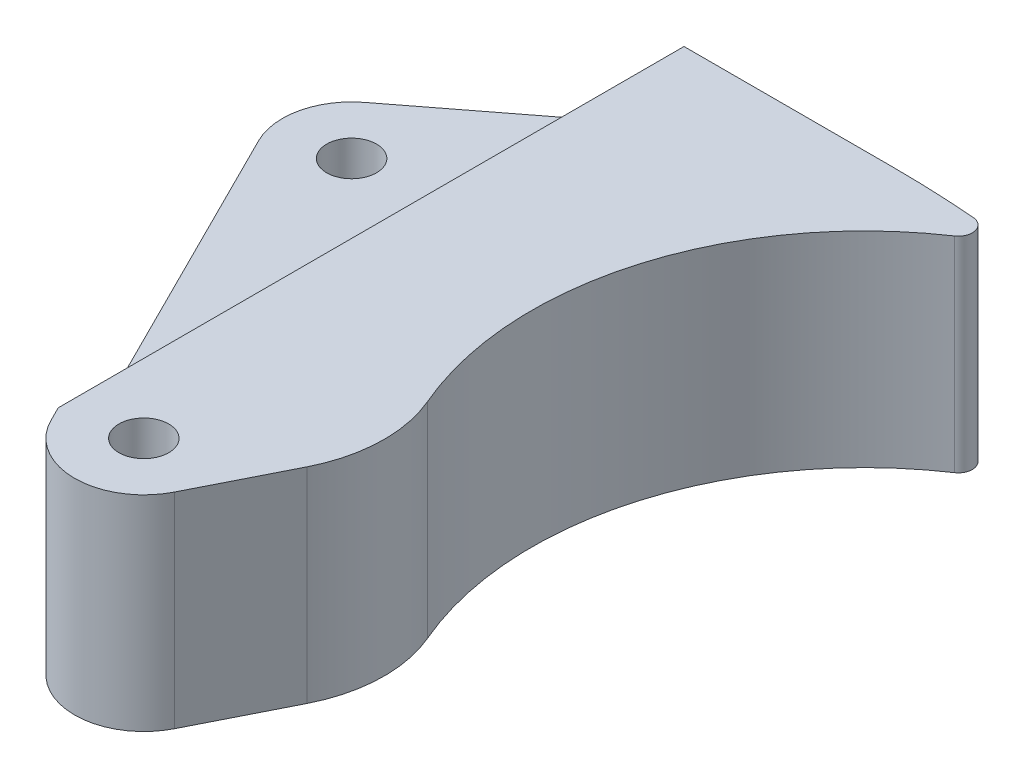
ISO-10303-21;
HEADER;
FILE_DESCRIPTION(('STEP AP214'),'2;1');
FILE_NAME('part.step','',(''),(''),'','','');
FILE_SCHEMA(('AUTOMOTIVE_DESIGN { 1 0 10303 214 1 1 1 1 }'));
ENDSEC;
DATA;
#1=APPLICATION_CONTEXT('core data for automotive mechanical design processes');
#2=APPLICATION_PROTOCOL_DEFINITION('international standard','automotive_design',2000,#1);
#3=PRODUCT_CONTEXT('',#1,'mechanical');
#4=PRODUCT('Part','Part','',(#3));
#5=PRODUCT_RELATED_PRODUCT_CATEGORY('part','',(#4));
#6=PRODUCT_DEFINITION_FORMATION('','',#4);
#7=PRODUCT_DEFINITION_CONTEXT('part definition',#1,'design');
#8=PRODUCT_DEFINITION('design','',#6,#7);
#9=PRODUCT_DEFINITION_SHAPE('','',#8);
#10=(LENGTH_UNIT() NAMED_UNIT(*) SI_UNIT(.MILLI.,.METRE.));
#11=(NAMED_UNIT(*) PLANE_ANGLE_UNIT() SI_UNIT($,.RADIAN.));
#12=(NAMED_UNIT(*) SI_UNIT($,.STERADIAN.) SOLID_ANGLE_UNIT());
#13=UNCERTAINTY_MEASURE_WITH_UNIT(LENGTH_MEASURE(1.E-05),#10,'distance_accuracy_value','');
#14=(GEOMETRIC_REPRESENTATION_CONTEXT(3) GLOBAL_UNCERTAINTY_ASSIGNED_CONTEXT((#13)) GLOBAL_UNIT_ASSIGNED_CONTEXT((#10,
#11,#12)) REPRESENTATION_CONTEXT('',''));
#15=CARTESIAN_POINT('',(0.,0.,0.));
#16=DIRECTION('',(0.,0.,1.));
#17=DIRECTION('',(1.,0.,0.));
#18=AXIS2_PLACEMENT_3D('',#15,#16,#17);
#19=CARTESIAN_POINT('',(38.1,76.2,-27.94));
#20=DIRECTION('',(0.,-1.,0.));
#21=DIRECTION('',(0.,0.,-1.));
#22=AXIS2_PLACEMENT_3D('',#19,#20,#21);
#23=CYLINDRICAL_SURFACE('',#22,30.48);
#24=CARTESIAN_POINT('',(38.1,57.404,-27.94));
#25=DIRECTION('',(0.,1.,0.));
#26=DIRECTION('',(0.,0.,1.));
#27=AXIS2_PLACEMENT_3D('',#24,#25,#26);
#28=CIRCLE('',#27,30.48);
#29=CARTESIAN_POINT('',(10.0799732428598,57.404,-15.9438130837692));
#30=VERTEX_POINT('',#29);
#31=CARTESIAN_POINT('',(21.103239153631,57.404,-53.2409984137255));
#32=VERTEX_POINT('',#31);
#33=EDGE_CURVE('E143',#30,#32,#28,.F.);
#34=ORIENTED_EDGE('',*,*,#33,.T.);
#35=DIRECTION('',(0.,-1.,0.));
#36=VECTOR('',#35,1.);
#37=CARTESIAN_POINT('',(21.103239153631,76.2,-53.2409984137255));
#38=LINE('',#37,#36);
#39=CARTESIAN_POINT('',(21.103239153631,76.2,-53.2409984137255));
#40=VERTEX_POINT('',#39);
#41=EDGE_CURVE('E146',#32,#40,#38,.F.);
#42=ORIENTED_EDGE('',*,*,#41,.T.);
#43=CARTESIAN_POINT('',(38.1,76.2,-27.94));
#44=DIRECTION('',(0.,-1.,0.));
#45=DIRECTION('',(0.,0.,1.));
#46=AXIS2_PLACEMENT_3D('',#43,#44,#45);
#47=CIRCLE('',#46,30.48);
#48=CARTESIAN_POINT('',(10.0799732428598,76.2,-15.9438130837692));
#49=VERTEX_POINT('',#48);
#50=EDGE_CURVE('E177',#49,#40,#47,.T.);
#51=ORIENTED_EDGE('',*,*,#50,.F.);
#52=DIRECTION('',(0.,-1.,0.));
#53=VECTOR('',#52,1.);
#54=CARTESIAN_POINT('',(10.0799732428598,76.2,-15.9438130837692));
#55=LINE('',#54,#53);
#56=EDGE_CURVE('E149',#49,#30,#55,.T.);
#57=ORIENTED_EDGE('',*,*,#56,.T.);
#58=EDGE_LOOP('',(#34,#42,#51,#57));
#59=FACE_BOUND('',#58,.T.);
#60=ADVANCED_FACE('F42',(#59),#23,.F.);
#61=CARTESIAN_POINT('',(12.7,76.2,39.5990316571237));
#62=DIRECTION('',(0.,-1.,0.));
#63=DIRECTION('',(0.,0.,-1.));
#64=AXIS2_PLACEMENT_3D('',#61,#62,#63);
#65=CYLINDRICAL_SURFACE('',#64,95.4790316571237);
#66=CARTESIAN_POINT('',(12.7,57.404,39.5990316571237));
#67=DIRECTION('',(0.,-1.,0.));
#68=DIRECTION('',(0.,0.,-1.));
#69=AXIS2_PLACEMENT_3D('',#66,#67,#68);
#70=CIRCLE('',#69,95.4790316571237);
#71=CARTESIAN_POINT('',(12.7,57.404,-55.88));
#72=VERTEX_POINT('',#71);
#73=CARTESIAN_POINT('',(20.4987750196921,57.404,-55.5609630590082));
#74=VERTEX_POINT('',#73);
#75=EDGE_CURVE('E58',#72,#74,#70,.T.);
#76=ORIENTED_EDGE('',*,*,#75,.F.);
#77=DIRECTION('',(0.,-1.,0.));
#78=VECTOR('',#77,1.);
#79=CARTESIAN_POINT('',(12.7,76.2,-55.88));
#80=LINE('',#79,#78);
#81=CARTESIAN_POINT('',(12.7,76.2,-55.88));
#82=VERTEX_POINT('',#81);
#83=EDGE_CURVE('E242',#82,#72,#80,.T.);
#84=ORIENTED_EDGE('',*,*,#83,.F.);
#85=CARTESIAN_POINT('',(12.7,76.2,39.5990316571237));
#86=DIRECTION('',(0.,1.,0.));
#87=DIRECTION('',(0.,0.,1.));
#88=AXIS2_PLACEMENT_3D('',#85,#86,#87);
#89=CIRCLE('',#88,95.4790316571237);
#90=CARTESIAN_POINT('',(20.4987750196921,76.2,-55.5609630590082));
#91=VERTEX_POINT('',#90);
#92=EDGE_CURVE('E182',#91,#82,#89,.T.);
#93=ORIENTED_EDGE('',*,*,#92,.F.);
#94=DIRECTION('',(0.,-1.,0.));
#95=VECTOR('',#94,1.);
#96=CARTESIAN_POINT('',(20.4987750196921,76.2,-55.5609630590082));
#97=LINE('',#96,#95);
#98=EDGE_CURVE('E163',#91,#74,#97,.T.);
#99=ORIENTED_EDGE('',*,*,#98,.T.);
#100=EDGE_LOOP('',(#76,#84,#93,#99));
#101=FACE_BOUND('',#100,.T.);
#102=ADVANCED_FACE('F298',(#101),#65,.T.);
#103=CARTESIAN_POINT('',(-6.35000000000001,76.2,-55.88));
#104=DIRECTION('',(0.,0.,1.));
#105=DIRECTION('',(1.,0.,0.));
#106=AXIS2_PLACEMENT_3D('',#103,#104,#105);
#107=PLANE('',#106);
#108=DIRECTION('',(1.,0.,0.));
#109=VECTOR('',#108,1.);
#110=CARTESIAN_POINT('',(-6.35000000000001,57.404,-55.88));
#111=LINE('',#110,#109);
#112=CARTESIAN_POINT('',(-6.35000000000001,57.404,-55.88));
#113=VERTEX_POINT('',#112);
#114=EDGE_CURVE('E280',#113,#72,#111,.T.);
#115=ORIENTED_EDGE('',*,*,#114,.F.);
#116=DIRECTION('',(0.,-1.,0.));
#117=VECTOR('',#116,1.);
#118=CARTESIAN_POINT('',(-6.35000000000001,0.,-55.88));
#119=LINE('',#118,#117);
#120=CARTESIAN_POINT('',(-6.35000000000001,63.5,-55.88));
#121=VERTEX_POINT('',#120);
#122=EDGE_CURVE('E195',#121,#113,#119,.T.);
#123=ORIENTED_EDGE('',*,*,#122,.F.);
#124=DIRECTION('',(0.,-1.,0.));
#125=VECTOR('',#124,1.);
#126=CARTESIAN_POINT('',(-6.35000000000001,76.2,-55.88));
#127=LINE('',#126,#125);
#128=CARTESIAN_POINT('',(-6.35,69.85,-55.88));
#129=VERTEX_POINT('',#128);
#130=EDGE_CURVE('E238',#129,#121,#127,.T.);
#131=ORIENTED_EDGE('',*,*,#130,.F.);
#132=CARTESIAN_POINT('',(-6.35000000000001,76.2,-55.88));
#133=VERTEX_POINT('',#132);
#134=EDGE_CURVE('E239',#133,#129,#127,.T.);
#135=ORIENTED_EDGE('',*,*,#134,.F.);
#136=DIRECTION('',(-1.,0.,0.));
#137=VECTOR('',#136,1.);
#138=CARTESIAN_POINT('',(-6.35000000000001,76.2,-55.88));
#139=LINE('',#138,#137);
#140=EDGE_CURVE('E235',#82,#133,#139,.T.);
#141=ORIENTED_EDGE('',*,*,#140,.F.);
#142=ORIENTED_EDGE('',*,*,#83,.T.);
#143=EDGE_LOOP('',(#115,#123,#131,#135,#141,#142));
#144=FACE_BOUND('',#143,.T.);
#145=ADVANCED_FACE('F278',(#144),#107,.F.);
#146=CARTESIAN_POINT('',(-6.35000000000001,0.,6.35));
#147=DIRECTION('',(1.,0.,0.));
#148=DIRECTION('',(0.,0.,-1.));
#149=AXIS2_PLACEMENT_3D('',#146,#147,#148);
#150=PLANE('',#149);
#151=ORIENTED_EDGE('',*,*,#122,.T.);
#152=DIRECTION('',(0.,0.,1.));
#153=VECTOR('',#152,1.);
#154=CARTESIAN_POINT('',(-6.35000000000001,57.404,6.34999999999999));
#155=LINE('',#154,#153);
#156=CARTESIAN_POINT('',(-6.35000000000001,57.404,1.49903165712365));
#157=VERTEX_POINT('',#156);
#158=EDGE_CURVE('E166',#113,#157,#155,.T.);
#159=ORIENTED_EDGE('',*,*,#158,.T.);
#160=DIRECTION('',(0.,-1.,0.));
#161=VECTOR('',#160,1.);
#162=CARTESIAN_POINT('',(-6.35000000000001,76.2,1.49903165712365));
#163=LINE('',#162,#161);
#164=CARTESIAN_POINT('',(-6.35000000000001,63.5,1.49903165712365));
#165=VERTEX_POINT('',#164);
#166=EDGE_CURVE('E225',#165,#157,#163,.T.);
#167=ORIENTED_EDGE('',*,*,#166,.F.);
#168=DIRECTION('',(0.,0.,-1.));
#169=VECTOR('',#168,1.);
#170=CARTESIAN_POINT('',(-6.35000000000001,63.5,6.35));
#171=LINE('',#170,#169);
#172=EDGE_CURVE('E198',#165,#121,#171,.T.);
#173=ORIENTED_EDGE('',*,*,#172,.T.);
#174=EDGE_LOOP('',(#151,#159,#167,#173));
#175=FACE_BOUND('',#174,.T.);
#176=ADVANCED_FACE('F261',(#175),#150,.F.);
#177=CARTESIAN_POINT('',(20.3950407850323,76.2,-54.295206680964));
#178=DIRECTION('',(0.,1.,0.));
#179=DIRECTION('',(0.,0.,1.));
#180=AXIS2_PLACEMENT_3D('',#177,#178,#179);
#181=CYLINDRICAL_SURFACE('',#180,1.27);
#182=ORIENTED_EDGE('',*,*,#41,.F.);
#183=CARTESIAN_POINT('',(20.3950407850323,57.404,-54.295206680964));
#184=DIRECTION('',(0.,-1.,0.));
#185=DIRECTION('',(0.,0.,-1.));
#186=AXIS2_PLACEMENT_3D('',#183,#184,#185);
#187=CIRCLE('',#186,1.27);
#188=EDGE_CURVE('E154',#32,#74,#187,.F.);
#189=ORIENTED_EDGE('',*,*,#188,.T.);
#190=ORIENTED_EDGE('',*,*,#98,.F.);
#191=CARTESIAN_POINT('',(20.3950407850323,76.2,-54.295206680964));
#192=DIRECTION('',(0.,1.,0.));
#193=DIRECTION('',(0.,0.,1.));
#194=AXIS2_PLACEMENT_3D('',#191,#192,#193);
#195=CIRCLE('',#194,1.27);
#196=EDGE_CURVE('E162',#40,#91,#195,.T.);
#197=ORIENTED_EDGE('',*,*,#196,.F.);
#198=EDGE_LOOP('',(#182,#189,#190,#197));
#199=FACE_BOUND('',#198,.T.);
#200=ADVANCED_FACE('F161',(#199),#181,.T.);
#201=CARTESIAN_POINT('',(12.7,76.2,39.5990316571237));
#202=DIRECTION('',(0.,1.,0.));
#203=DIRECTION('',(0.,0.,1.));
#204=AXIS2_PLACEMENT_3D('',#201,#202,#203);
#205=PLANE('',#204);
#206=DIRECTION('',(0.450015260137261,0.,-0.893020865178185));
#207=VECTOR('',#206,1.);
#208=CARTESIAN_POINT('',(5.67068249388147,76.2,2.8575969018716));
#209=LINE('',#208,#207);
#210=CARTESIAN_POINT('',(5.67068249388147,76.2,2.8575969018716));
#211=VERTEX_POINT('',#210);
#212=CARTESIAN_POINT('',(9.74632708181432,76.2,-5.23020806492983));
#213=VERTEX_POINT('',#212);
#214=EDGE_CURVE('E176',#211,#213,#209,.T.);
#215=ORIENTED_EDGE('',*,*,#214,.T.);
#216=CARTESIAN_POINT('',(-1.59503790594863,76.2,-10.945401868673));
#217=DIRECTION('',(0.,1.,0.));
#218=DIRECTION('',(0.,0.,1.));
#219=AXIS2_PLACEMENT_3D('',#216,#217,#218);
#220=CIRCLE('',#219,12.7);
#221=EDGE_CURVE('E11',#213,#49,#220,.T.);
#222=ORIENTED_EDGE('',*,*,#221,.T.);
#223=ORIENTED_EDGE('',*,*,#50,.T.);
#224=ORIENTED_EDGE('',*,*,#196,.T.);
#225=ORIENTED_EDGE('',*,*,#92,.T.);
#226=ORIENTED_EDGE('',*,*,#140,.T.);
#227=DIRECTION('',(0.,0.,-1.));
#228=VECTOR('',#227,1.);
#229=CARTESIAN_POINT('',(-6.35,76.2,6.35));
#230=LINE('',#229,#228);
#231=CARTESIAN_POINT('',(-6.35,76.2,1.49903165712367));
#232=VERTEX_POINT('',#231);
#233=EDGE_CURVE('E199',#232,#133,#230,.T.);
#234=ORIENTED_EDGE('',*,*,#233,.F.);
#235=DIRECTION('',(0.447213595499958,0.,0.894427190999916));
#236=VECTOR('',#235,1.);
#237=CARTESIAN_POINT('',(-5.67961266284947,76.2,2.83980633142473));
#238=LINE('',#237,#236);
#239=CARTESIAN_POINT('',(-5.67961266284947,76.2,2.83980633142473));
#240=VERTEX_POINT('',#239);
#241=EDGE_CURVE('E231',#232,#240,#238,.T.);
#242=ORIENTED_EDGE('',*,*,#241,.T.);
#243=CARTESIAN_POINT('',(0.,76.2,0.));
#244=DIRECTION('',(0.,1.,0.));
#245=DIRECTION('',(0.,0.,1.));
#246=AXIS2_PLACEMENT_3D('',#243,#244,#245);
#247=CIRCLE('',#246,6.35);
#248=EDGE_CURVE('E178',#240,#211,#247,.T.);
#249=ORIENTED_EDGE('',*,*,#248,.T.);
#250=EDGE_LOOP('',(#215,#222,#223,#224,#225,#226,#234,#242,#249));
#251=FACE_BOUND('',#250,.T.);
#252=CARTESIAN_POINT('',(0.,76.2,0.));
#253=DIRECTION('',(0.,1.,0.));
#254=DIRECTION('',(0.,0.,1.));
#255=AXIS2_PLACEMENT_3D('',#252,#253,#254);
#256=CIRCLE('',#255,2.286);
#257=CARTESIAN_POINT('',(0.,76.2,-2.286));
#258=VERTEX_POINT('',#257);
#259=EDGE_CURVE('E228',#258,#258,#256,.T.);
#260=ORIENTED_EDGE('',*,*,#259,.F.);
#261=EDGE_LOOP('',(#260));
#262=FACE_BOUND('',#261,.T.);
#263=ADVANCED_FACE('F295',(#251,#262),#205,.T.);
#264=CARTESIAN_POINT('',(-22.9215496675251,76.2,-43.1332497625179));
#265=DIRECTION('',(0.60969286102757,0.,0.792637757876835));
#266=DIRECTION('',(0.792637757876835,0.,-0.60969286102757));
#267=AXIS2_PLACEMENT_3D('',#264,#265,#266);
#268=PLANE('',#267);
#269=ORIENTED_EDGE('',*,*,#130,.T.);
#270=DIRECTION('',(-0.792637757876835,0.,0.60969286102757));
#271=VECTOR('',#270,1.);
#272=CARTESIAN_POINT('',(-22.9215496675251,63.5,-43.1332497625179));
#273=LINE('',#272,#271);
#274=CARTESIAN_POINT('',(-22.9215496675251,63.5,-43.1332497625179));
#275=VERTEX_POINT('',#274);
#276=EDGE_CURVE('E219',#121,#275,#273,.T.);
#277=ORIENTED_EDGE('',*,*,#276,.T.);
#278=DIRECTION('',(0.,-1.,0.));
#279=VECTOR('',#278,1.);
#280=CARTESIAN_POINT('',(-22.9215496675251,76.2,-43.1332497625179));
#281=LINE('',#280,#279);
#282=CARTESIAN_POINT('',(-22.9215496675251,69.85,-43.1332497625179));
#283=VERTEX_POINT('',#282);
#284=EDGE_CURVE('E253',#283,#275,#281,.T.);
#285=ORIENTED_EDGE('',*,*,#284,.F.);
#286=DIRECTION('',(0.792637757876835,0.,-0.60969286102757));
#287=VECTOR('',#286,1.);
#288=CARTESIAN_POINT('',(-22.9215496675251,69.85,-43.1332497625179));
#289=LINE('',#288,#287);
#290=EDGE_CURVE('E210',#283,#129,#289,.T.);
#291=ORIENTED_EDGE('',*,*,#290,.T.);
#292=EDGE_LOOP('',(#269,#277,#285,#291));
#293=FACE_BOUND('',#292,.T.);
#294=ADVANCED_FACE('F281',(#293),#268,.F.);
#295=CARTESIAN_POINT('',(-19.05,76.2,-38.1));
#296=DIRECTION('',(0.,-1.,0.));
#297=DIRECTION('',(0.,0.,-1.));
#298=AXIS2_PLACEMENT_3D('',#295,#296,#297);
#299=CYLINDRICAL_SURFACE('',#298,6.35);
#300=CARTESIAN_POINT('',(-19.05,63.5,-38.1));
#301=DIRECTION('',(0.,1.,0.));
#302=DIRECTION('',(0.,0.,1.));
#303=AXIS2_PLACEMENT_3D('',#300,#301,#302);
#304=CIRCLE('',#303,6.35);
#305=CARTESIAN_POINT('',(-24.7296126628495,63.5,-35.2601936685753));
#306=VERTEX_POINT('',#305);
#307=EDGE_CURVE('E217',#275,#306,#304,.T.);
#308=ORIENTED_EDGE('',*,*,#307,.T.);
#309=DIRECTION('',(0.,-1.,0.));
#310=VECTOR('',#309,1.);
#311=CARTESIAN_POINT('',(-24.7296126628495,76.2,-35.2601936685753));
#312=LINE('',#311,#310);
#313=CARTESIAN_POINT('',(-24.7296126628495,69.85,-35.2601936685753));
#314=VERTEX_POINT('',#313);
#315=EDGE_CURVE('E250',#314,#306,#312,.T.);
#316=ORIENTED_EDGE('',*,*,#315,.F.);
#317=CARTESIAN_POINT('',(-19.05,69.85,-38.1));
#318=DIRECTION('',(0.,-1.,0.));
#319=DIRECTION('',(0.,0.,-1.));
#320=AXIS2_PLACEMENT_3D('',#317,#318,#319);
#321=CIRCLE('',#320,6.35);
#322=EDGE_CURVE('E207',#314,#283,#321,.T.);
#323=ORIENTED_EDGE('',*,*,#322,.T.);
#324=ORIENTED_EDGE('',*,*,#284,.T.);
#325=EDGE_LOOP('',(#308,#316,#323,#324));
#326=FACE_BOUND('',#325,.T.);
#327=ADVANCED_FACE('F286',(#326),#299,.T.);
#328=CARTESIAN_POINT('',(-5.67961266284947,76.2,2.83980633142473));
#329=DIRECTION('',(0.894427190999916,0.,-0.447213595499958));
#330=DIRECTION('',(-0.447213595499958,0.,-0.894427190999916));
#331=AXIS2_PLACEMENT_3D('',#328,#329,#330);
#332=PLANE('',#331);
#333=ORIENTED_EDGE('',*,*,#166,.T.);
#334=DIRECTION('',(0.447213595499958,0.,0.894427190999916));
#335=VECTOR('',#334,1.);
#336=CARTESIAN_POINT('',(-5.67961266284946,57.404,2.83980633142474));
#337=LINE('',#336,#335);
#338=CARTESIAN_POINT('',(-5.67961266284947,57.404,2.83980633142473));
#339=VERTEX_POINT('',#338);
#340=EDGE_CURVE('E188',#157,#339,#337,.T.);
#341=ORIENTED_EDGE('',*,*,#340,.T.);
#342=DIRECTION('',(0.,-1.,0.));
#343=VECTOR('',#342,1.);
#344=CARTESIAN_POINT('',(-5.67961266284947,76.2,2.83980633142473));
#345=LINE('',#344,#343);
#346=EDGE_CURVE('E247',#240,#339,#345,.T.);
#347=ORIENTED_EDGE('',*,*,#346,.F.);
#348=ORIENTED_EDGE('',*,*,#241,.F.);
#349=DIRECTION('',(0.,-1.,0.));
#350=VECTOR('',#349,1.);
#351=CARTESIAN_POINT('',(-6.35,76.2,1.49903165712366));
#352=LINE('',#351,#350);
#353=CARTESIAN_POINT('',(-6.35,69.85,1.49903165712366));
#354=VERTEX_POINT('',#353);
#355=EDGE_CURVE('E222',#232,#354,#352,.T.);
#356=ORIENTED_EDGE('',*,*,#355,.T.);
#357=DIRECTION('',(-0.447213595499958,0.,-0.894427190999916));
#358=VECTOR('',#357,1.);
#359=CARTESIAN_POINT('',(-5.67961266284947,69.85,2.83980633142473));
#360=LINE('',#359,#358);
#361=EDGE_CURVE('E204',#354,#314,#360,.T.);
#362=ORIENTED_EDGE('',*,*,#361,.T.);
#363=ORIENTED_EDGE('',*,*,#315,.T.);
#364=DIRECTION('',(0.447213595499958,0.,0.894427190999916));
#365=VECTOR('',#364,1.);
#366=CARTESIAN_POINT('',(-5.67961266284947,63.5,2.83980633142473));
#367=LINE('',#366,#365);
#368=EDGE_CURVE('E214',#306,#165,#367,.T.);
#369=ORIENTED_EDGE('',*,*,#368,.T.);
#370=EDGE_LOOP('',(#333,#341,#347,#348,#356,#362,#363,#369));
#371=FACE_BOUND('',#370,.T.);
#372=ADVANCED_FACE('F266',(#371),#332,.F.);
#373=CARTESIAN_POINT('',(0.,76.2,0.));
#374=DIRECTION('',(0.,-1.,0.));
#375=DIRECTION('',(0.,0.,-1.));
#376=AXIS2_PLACEMENT_3D('',#373,#374,#375);
#377=CYLINDRICAL_SURFACE('',#376,6.35);
#378=CARTESIAN_POINT('',(0.,57.404,0.));
#379=DIRECTION('',(0.,1.,0.));
#380=DIRECTION('',(0.,0.,1.));
#381=AXIS2_PLACEMENT_3D('',#378,#379,#380);
#382=CIRCLE('',#381,6.35);
#383=CARTESIAN_POINT('',(5.67068249388147,57.404,2.8575969018716));
#384=VERTEX_POINT('',#383);
#385=EDGE_CURVE('E184',#339,#384,#382,.T.);
#386=ORIENTED_EDGE('',*,*,#385,.T.);
#387=DIRECTION('',(0.,-1.,0.));
#388=VECTOR('',#387,1.);
#389=CARTESIAN_POINT('',(5.67068249388147,76.2,2.8575969018716));
#390=LINE('',#389,#388);
#391=EDGE_CURVE('E245',#211,#384,#390,.T.);
#392=ORIENTED_EDGE('',*,*,#391,.F.);
#393=ORIENTED_EDGE('',*,*,#248,.F.);
#394=ORIENTED_EDGE('',*,*,#346,.T.);
#395=EDGE_LOOP('',(#386,#392,#393,#394));
#396=FACE_BOUND('',#395,.T.);
#397=ADVANCED_FACE('F293',(#396),#377,.T.);
#398=CARTESIAN_POINT('',(5.67068249388147,76.2,2.8575969018716));
#399=DIRECTION('',(-0.893020865178185,0.,-0.450015260137261));
#400=DIRECTION('',(-0.450015260137261,0.,0.893020865178185));
#401=AXIS2_PLACEMENT_3D('',#398,#399,#400);
#402=PLANE('',#401);
#403=DIRECTION('',(0.450015260137261,0.,-0.893020865178185));
#404=VECTOR('',#403,1.);
#405=CARTESIAN_POINT('',(5.67068249388147,57.404,2.85759690187161));
#406=LINE('',#405,#404);
#407=CARTESIAN_POINT('',(9.74632708181432,57.404,-5.23020806492983));
#408=VERTEX_POINT('',#407);
#409=EDGE_CURVE('E151',#384,#408,#406,.T.);
#410=ORIENTED_EDGE('',*,*,#409,.T.);
#411=DIRECTION('',(0.,-1.,0.));
#412=VECTOR('',#411,1.);
#413=CARTESIAN_POINT('',(9.74632708181432,76.2,-5.23020806492983));
#414=LINE('',#413,#412);
#415=EDGE_CURVE('E51',#408,#213,#414,.F.);
#416=ORIENTED_EDGE('',*,*,#415,.T.);
#417=ORIENTED_EDGE('',*,*,#214,.F.);
#418=ORIENTED_EDGE('',*,*,#391,.T.);
#419=EDGE_LOOP('',(#410,#416,#417,#418));
#420=FACE_BOUND('',#419,.T.);
#421=ADVANCED_FACE('F307',(#420),#402,.F.);
#422=CARTESIAN_POINT('',(0.,76.2,0.));
#423=DIRECTION('',(0.,-1.,0.));
#424=DIRECTION('',(0.,0.,-1.));
#425=AXIS2_PLACEMENT_3D('',#422,#423,#424);
#426=CYLINDRICAL_SURFACE('',#425,2.286);
#427=CARTESIAN_POINT('',(0.,57.404,0.));
#428=DIRECTION('',(0.,1.,0.));
#429=DIRECTION('',(0.,0.,1.));
#430=AXIS2_PLACEMENT_3D('',#427,#428,#429);
#431=CIRCLE('',#430,2.286);
#432=CARTESIAN_POINT('',(0.,57.404,-2.286));
#433=VERTEX_POINT('',#432);
#434=EDGE_CURVE('E152',#433,#433,#431,.T.);
#435=CARTESIAN_POINT('',(0.,57.404,-2.286));
#436=CARTESIAN_POINT('',(0.,57.5997916666667,-2.286));
#437=CARTESIAN_POINT('',(0.,57.7955833333333,-2.286));
#438=CARTESIAN_POINT('',(0.,58.1871666666667,-2.286));
#439=CARTESIAN_POINT('',(0.,58.3829583333333,-2.286));
#440=CARTESIAN_POINT('',(0.,58.7745416666667,-2.286));
#441=CARTESIAN_POINT('',(0.,58.9703333333333,-2.286));
#442=CARTESIAN_POINT('',(0.,59.3619166666667,-2.286));
#443=CARTESIAN_POINT('',(0.,59.5577083333333,-2.286));
#444=CARTESIAN_POINT('',(0.,59.9492916666667,-2.286));
#445=CARTESIAN_POINT('',(0.,60.1450833333333,-2.286));
#446=CARTESIAN_POINT('',(0.,60.5366666666667,-2.286));
#447=CARTESIAN_POINT('',(0.,60.7324583333333,-2.286));
#448=CARTESIAN_POINT('',(0.,61.1240416666667,-2.286));
#449=CARTESIAN_POINT('',(0.,61.3198333333333,-2.286));
#450=CARTESIAN_POINT('',(0.,61.7114166666667,-2.286));
#451=CARTESIAN_POINT('',(0.,61.9072083333333,-2.286));
#452=CARTESIAN_POINT('',(0.,62.2987916666667,-2.286));
#453=CARTESIAN_POINT('',(0.,62.4945833333333,-2.286));
#454=CARTESIAN_POINT('',(0.,62.8861666666667,-2.286));
#455=CARTESIAN_POINT('',(0.,63.0819583333333,-2.286));
#456=CARTESIAN_POINT('',(0.,63.4735416666667,-2.286));
#457=CARTESIAN_POINT('',(0.,63.6693333333333,-2.286));
#458=CARTESIAN_POINT('',(0.,64.0609166666667,-2.286));
#459=CARTESIAN_POINT('',(0.,64.2567083333333,-2.286));
#460=CARTESIAN_POINT('',(0.,64.6482916666667,-2.286));
#461=CARTESIAN_POINT('',(0.,64.8440833333333,-2.286));
#462=CARTESIAN_POINT('',(0.,65.2356666666667,-2.286));
#463=CARTESIAN_POINT('',(0.,65.4314583333333,-2.286));
#464=CARTESIAN_POINT('',(0.,65.8230416666667,-2.286));
#465=CARTESIAN_POINT('',(0.,66.0188333333333,-2.286));
#466=CARTESIAN_POINT('',(0.,66.4104166666667,-2.286));
#467=CARTESIAN_POINT('',(0.,66.6062083333333,-2.286));
#468=CARTESIAN_POINT('',(0.,66.9977916666667,-2.286));
#469=CARTESIAN_POINT('',(0.,67.1935833333333,-2.286));
#470=CARTESIAN_POINT('',(0.,67.5851666666667,-2.286));
#471=CARTESIAN_POINT('',(0.,67.7809583333333,-2.286));
#472=CARTESIAN_POINT('',(0.,68.1725416666667,-2.286));
#473=CARTESIAN_POINT('',(0.,68.3683333333333,-2.286));
#474=CARTESIAN_POINT('',(0.,68.7599166666667,-2.286));
#475=CARTESIAN_POINT('',(0.,68.9557083333333,-2.286));
#476=CARTESIAN_POINT('',(0.,69.3472916666667,-2.286));
#477=CARTESIAN_POINT('',(0.,69.5430833333333,-2.286));
#478=CARTESIAN_POINT('',(0.,69.9346666666667,-2.286));
#479=CARTESIAN_POINT('',(0.,70.1304583333333,-2.286));
#480=CARTESIAN_POINT('',(0.,70.5220416666667,-2.286));
#481=CARTESIAN_POINT('',(0.,70.7178333333333,-2.286));
#482=CARTESIAN_POINT('',(0.,71.1094166666667,-2.286));
#483=CARTESIAN_POINT('',(0.,71.3052083333333,-2.286));
#484=CARTESIAN_POINT('',(0.,71.6967916666667,-2.286));
#485=CARTESIAN_POINT('',(0.,71.8925833333333,-2.286));
#486=CARTESIAN_POINT('',(0.,72.2841666666667,-2.286));
#487=CARTESIAN_POINT('',(0.,72.4799583333333,-2.286));
#488=CARTESIAN_POINT('',(0.,72.8715416666667,-2.286));
#489=CARTESIAN_POINT('',(0.,73.0673333333333,-2.286));
#490=CARTESIAN_POINT('',(0.,73.4589166666667,-2.286));
#491=CARTESIAN_POINT('',(0.,73.6547083333333,-2.286));
#492=CARTESIAN_POINT('',(0.,74.0462916666667,-2.286));
#493=CARTESIAN_POINT('',(0.,74.2420833333333,-2.286));
#494=CARTESIAN_POINT('',(0.,74.6336666666667,-2.286));
#495=CARTESIAN_POINT('',(0.,74.8294583333333,-2.286));
#496=CARTESIAN_POINT('',(0.,75.2210416666667,-2.286));
#497=CARTESIAN_POINT('',(0.,75.4168333333333,-2.286));
#498=CARTESIAN_POINT('',(0.,75.8084166666667,-2.286));
#499=CARTESIAN_POINT('',(0.,76.0042083333333,-2.286));
#500=CARTESIAN_POINT('',(0.,76.2,-2.286));
#501=B_SPLINE_CURVE_WITH_KNOTS('',3,(#435,#436,#437,#438,#439,#440,#441,#442,#443,#444,#445,
#446,#447,#448,#449,#450,#451,#452,#453,#454,#455,#456,#457,#458,#459,#460,#461,#462,#463,#464,
#465,#466,#467,#468,#469,#470,#471,#472,#473,#474,#475,#476,#477,#478,#479,#480,#481,#482,#483,
#484,#485,#486,#487,#488,#489,#490,#491,#492,#493,#494,#495,#496,#497,#498,#499,#500),
.UNSPECIFIED.,.F.,.F.,(4,2,2,2,2,2,2,2,2,2,2,2,2,2,2,2,2,2,2,2,2,2,2,2,2,2,2,2,2,2,2,2,4),(0.,
0.587375000000001,1.17475,1.762125,2.34949999999999,2.93687499999999,3.52424999999999,
4.11162499999999,4.69899999999999,5.286375,5.87375,6.461125,7.04849999999999,7.63587499999999,
8.22324999999999,8.81062499999999,9.39799999999999,9.98537499999999,10.57275,11.160125,11.7475,
12.334875,12.92225,13.509625,14.097,14.684375,15.27175,15.859125,16.4465,17.033875,17.62125,
18.208625,18.796),.UNSPECIFIED.);
#502=EDGE_CURVE('BSEAM310',#433,#258,#501,.T.);
#503=ORIENTED_EDGE('',*,*,#434,.F.);
#504=ORIENTED_EDGE('',*,*,#259,.T.);
#505=ORIENTED_EDGE('',*,*,#502,.T.);
#506=ORIENTED_EDGE('',*,*,#502,.F.);
#507=EDGE_LOOP('',(#503,#505,#504,#506));
#508=FACE_BOUND('',#507,.T.);
#509=ADVANCED_FACE('F310',(#508),#426,.F.);
#510=CARTESIAN_POINT('',(-6.35,76.2,6.35));
#511=DIRECTION('',(1.,0.,0.));
#512=DIRECTION('',(0.,0.,-1.));
#513=AXIS2_PLACEMENT_3D('',#510,#511,#512);
#514=PLANE('',#513);
#515=ORIENTED_EDGE('',*,*,#233,.T.);
#516=ORIENTED_EDGE('',*,*,#134,.T.);
#517=DIRECTION('',(0.,0.,-1.));
#518=VECTOR('',#517,1.);
#519=CARTESIAN_POINT('',(-6.35,69.85,6.35));
#520=LINE('',#519,#518);
#521=EDGE_CURVE('E194',#354,#129,#520,.T.);
#522=ORIENTED_EDGE('',*,*,#521,.F.);
#523=ORIENTED_EDGE('',*,*,#355,.F.);
#524=EDGE_LOOP('',(#515,#516,#522,#523));
#525=FACE_BOUND('',#524,.T.);
#526=ADVANCED_FACE('F340',(#525),#514,.F.);
#527=CARTESIAN_POINT('',(-25.4,69.85,6.35));
#528=DIRECTION('',(0.,-1.,0.));
#529=DIRECTION('',(0.,0.,-1.));
#530=AXIS2_PLACEMENT_3D('',#527,#528,#529);
#531=PLANE('',#530);
#532=CARTESIAN_POINT('',(-19.05,69.85,-38.1));
#533=DIRECTION('',(0.,-1.,0.));
#534=DIRECTION('',(0.,0.,-1.));
#535=AXIS2_PLACEMENT_3D('',#532,#533,#534);
#536=CIRCLE('',#535,2.286);
#537=CARTESIAN_POINT('',(-19.05,69.85,-40.386));
#538=VERTEX_POINT('',#537);
#539=EDGE_CURVE('E201',#538,#538,#536,.T.);
#540=ORIENTED_EDGE('',*,*,#539,.T.);
#541=EDGE_LOOP('',(#540));
#542=FACE_BOUND('',#541,.T.);
#543=ORIENTED_EDGE('',*,*,#322,.F.);
#544=ORIENTED_EDGE('',*,*,#361,.F.);
#545=ORIENTED_EDGE('',*,*,#521,.T.);
#546=ORIENTED_EDGE('',*,*,#290,.F.);
#547=EDGE_LOOP('',(#543,#544,#545,#546));
#548=FACE_BOUND('',#547,.T.);
#549=ADVANCED_FACE('F283',(#542,#548),#531,.F.);
#550=CARTESIAN_POINT('',(-6.35000000000001,63.5,6.35));
#551=DIRECTION('',(0.,1.,0.));
#552=DIRECTION('',(0.,0.,1.));
#553=AXIS2_PLACEMENT_3D('',#550,#551,#552);
#554=PLANE('',#553);
#555=CARTESIAN_POINT('',(-19.05,63.5,-38.1));
#556=DIRECTION('',(0.,1.,0.));
#557=DIRECTION('',(0.,0.,1.));
#558=AXIS2_PLACEMENT_3D('',#555,#556,#557);
#559=CIRCLE('',#558,2.286);
#560=CARTESIAN_POINT('',(-19.05,63.5,-40.386));
#561=VERTEX_POINT('',#560);
#562=EDGE_CURVE('E213',#561,#561,#559,.T.);
#563=ORIENTED_EDGE('',*,*,#562,.T.);
#564=EDGE_LOOP('',(#563));
#565=FACE_BOUND('',#564,.T.);
#566=ORIENTED_EDGE('',*,*,#172,.F.);
#567=ORIENTED_EDGE('',*,*,#368,.F.);
#568=ORIENTED_EDGE('',*,*,#307,.F.);
#569=ORIENTED_EDGE('',*,*,#276,.F.);
#570=EDGE_LOOP('',(#566,#567,#568,#569));
#571=FACE_BOUND('',#570,.T.);
#572=ADVANCED_FACE('F271',(#565,#571),#554,.F.);
#573=CARTESIAN_POINT('',(-19.05,76.2,-38.1));
#574=DIRECTION('',(0.,-1.,0.));
#575=DIRECTION('',(0.,0.,-1.));
#576=AXIS2_PLACEMENT_3D('',#573,#574,#575);
#577=CYLINDRICAL_SURFACE('',#576,2.286);
#578=CARTESIAN_POINT('',(-19.05,63.5,-40.386));
#579=CARTESIAN_POINT('',(-19.05,63.5661458333334,-40.386));
#580=CARTESIAN_POINT('',(-19.05,63.6322916666667,-40.386));
#581=CARTESIAN_POINT('',(-19.05,63.7645833333333,-40.386));
#582=CARTESIAN_POINT('',(-19.05,63.8307291666667,-40.386));
#583=CARTESIAN_POINT('',(-19.05,63.9630208333333,-40.386));
#584=CARTESIAN_POINT('',(-19.05,64.0291666666667,-40.386));
#585=CARTESIAN_POINT('',(-19.05,64.1614583333334,-40.386));
#586=CARTESIAN_POINT('',(-19.05,64.2276041666667,-40.386));
#587=CARTESIAN_POINT('',(-19.05,64.3598958333334,-40.386));
#588=CARTESIAN_POINT('',(-19.05,64.4260416666667,-40.386));
#589=CARTESIAN_POINT('',(-19.05,64.5583333333333,-40.386));
#590=CARTESIAN_POINT('',(-19.05,64.6244791666667,-40.386));
#591=CARTESIAN_POINT('',(-19.05,64.7567708333333,-40.386));
#592=CARTESIAN_POINT('',(-19.05,64.8229166666667,-40.386));
#593=CARTESIAN_POINT('',(-19.05,64.9552083333333,-40.386));
#594=CARTESIAN_POINT('',(-19.05,65.0213541666667,-40.386));
#595=CARTESIAN_POINT('',(-19.05,65.1536458333333,-40.386));
#596=CARTESIAN_POINT('',(-19.05,65.2197916666667,-40.386));
#597=CARTESIAN_POINT('',(-19.05,65.3520833333334,-40.386));
#598=CARTESIAN_POINT('',(-19.05,65.4182291666667,-40.386));
#599=CARTESIAN_POINT('',(-19.05,65.5505208333334,-40.386));
#600=CARTESIAN_POINT('',(-19.05,65.6166666666667,-40.386));
#601=CARTESIAN_POINT('',(-19.05,65.7489583333333,-40.386));
#602=CARTESIAN_POINT('',(-19.05,65.8151041666667,-40.386));
#603=CARTESIAN_POINT('',(-19.05,65.9473958333333,-40.386));
#604=CARTESIAN_POINT('',(-19.05,66.0135416666667,-40.386));
#605=CARTESIAN_POINT('',(-19.05,66.1458333333333,-40.386));
#606=CARTESIAN_POINT('',(-19.05,66.2119791666667,-40.386));
#607=CARTESIAN_POINT('',(-19.05,66.3442708333333,-40.386));
#608=CARTESIAN_POINT('',(-19.05,66.4104166666667,-40.386));
#609=CARTESIAN_POINT('',(-19.05,66.5427083333334,-40.386));
#610=CARTESIAN_POINT('',(-19.05,66.6088541666667,-40.386));
#611=CARTESIAN_POINT('',(-19.05,66.7411458333333,-40.386));
#612=CARTESIAN_POINT('',(-19.05,66.8072916666667,-40.386));
#613=CARTESIAN_POINT('',(-19.05,66.9395833333333,-40.386));
#614=CARTESIAN_POINT('',(-19.05,67.0057291666667,-40.386));
#615=CARTESIAN_POINT('',(-19.05,67.1380208333334,-40.386));
#616=CARTESIAN_POINT('',(-19.05,67.2041666666667,-40.386));
#617=CARTESIAN_POINT('',(-19.05,67.3364583333334,-40.386));
#618=CARTESIAN_POINT('',(-19.05,67.4026041666667,-40.386));
#619=CARTESIAN_POINT('',(-19.05,67.5348958333334,-40.386));
#620=CARTESIAN_POINT('',(-19.05,67.6010416666667,-40.386));
#621=CARTESIAN_POINT('',(-19.05,67.7333333333333,-40.386));
#622=CARTESIAN_POINT('',(-19.05,67.7994791666667,-40.386));
#623=CARTESIAN_POINT('',(-19.05,67.9317708333333,-40.386));
#624=CARTESIAN_POINT('',(-19.05,67.9979166666667,-40.386));
#625=CARTESIAN_POINT('',(-19.05,68.1302083333333,-40.386));
#626=CARTESIAN_POINT('',(-19.05,68.1963541666667,-40.386));
#627=CARTESIAN_POINT('',(-19.05,68.3286458333334,-40.386));
#628=CARTESIAN_POINT('',(-19.05,68.3947916666667,-40.386));
#629=CARTESIAN_POINT('',(-19.05,68.5270833333334,-40.386));
#630=CARTESIAN_POINT('',(-19.05,68.5932291666667,-40.386));
#631=CARTESIAN_POINT('',(-19.05,68.7255208333333,-40.386));
#632=CARTESIAN_POINT('',(-19.05,68.7916666666667,-40.386));
#633=CARTESIAN_POINT('',(-19.05,68.9239583333334,-40.386));
#634=CARTESIAN_POINT('',(-19.05,68.9901041666667,-40.386));
#635=CARTESIAN_POINT('',(-19.05,69.1223958333333,-40.386));
#636=CARTESIAN_POINT('',(-19.05,69.1885416666667,-40.386));
#637=CARTESIAN_POINT('',(-19.05,69.3208333333333,-40.386));
#638=CARTESIAN_POINT('',(-19.05,69.3869791666667,-40.386));
#639=CARTESIAN_POINT('',(-19.05,69.5192708333334,-40.386));
#640=CARTESIAN_POINT('',(-19.05,69.5854166666667,-40.386));
#641=CARTESIAN_POINT('',(-19.05,69.7177083333333,-40.386));
#642=CARTESIAN_POINT('',(-19.05,69.7838541666667,-40.386));
#643=CARTESIAN_POINT('',(-19.05,69.85,-40.386));
#644=B_SPLINE_CURVE_WITH_KNOTS('',3,(#578,#579,#580,#581,#582,#583,#584,#585,#586,#587,#588,
#589,#590,#591,#592,#593,#594,#595,#596,#597,#598,#599,#600,#601,#602,#603,#604,#605,#606,#607,
#608,#609,#610,#611,#612,#613,#614,#615,#616,#617,#618,#619,#620,#621,#622,#623,#624,#625,#626,
#627,#628,#629,#630,#631,#632,#633,#634,#635,#636,#637,#638,#639,#640,#641,#642,#643),
.UNSPECIFIED.,.F.,.F.,(4,2,2,2,2,2,2,2,2,2,2,2,2,2,2,2,2,2,2,2,2,2,2,2,2,2,2,2,2,2,2,2,4),(0.,
0.198437499999995,0.396874999999991,0.5953125,0.793749999999996,0.992187499999991,1.190625,
1.3890625,1.58749999999999,1.7859375,1.984375,2.18281249999999,2.38125,2.5796875,
2.77812499999999,2.9765625,3.175,3.37343749999999,3.571875,3.7703125,3.96874999999999,4.1671875,
4.365625,4.56406249999999,4.7625,4.9609375,5.15937499999999,5.3578125,5.55625,5.75468749999999,
5.953125,6.1515625,6.34999999999999),.UNSPECIFIED.);
#645=EDGE_CURVE('BSEAM325',#561,#538,#644,.T.);
#646=ORIENTED_EDGE('',*,*,#562,.F.);
#647=ORIENTED_EDGE('',*,*,#539,.F.);
#648=ORIENTED_EDGE('',*,*,#645,.T.);
#649=ORIENTED_EDGE('',*,*,#645,.F.);
#650=EDGE_LOOP('',(#646,#648,#647,#649));
#651=FACE_BOUND('',#650,.T.);
#652=ADVANCED_FACE('F325',(#651),#577,.F.);
#653=CARTESIAN_POINT('',(24.3886136889173,57.404,6.35));
#654=DIRECTION('',(0.,1.,0.));
#655=DIRECTION('',(0.,0.,1.));
#656=AXIS2_PLACEMENT_3D('',#653,#654,#655);
#657=PLANE('',#656);
#658=ORIENTED_EDGE('',*,*,#434,.T.);
#659=EDGE_LOOP('',(#658));
#660=FACE_BOUND('',#659,.T.);
#661=ORIENTED_EDGE('',*,*,#33,.F.);
#662=CARTESIAN_POINT('',(-1.59503790594863,57.404,-10.945401868673));
#663=DIRECTION('',(0.,1.,0.));
#664=DIRECTION('',(0.,0.,1.));
#665=AXIS2_PLACEMENT_3D('',#662,#663,#664);
#666=CIRCLE('',#665,12.7);
#667=EDGE_CURVE('E172',#30,#408,#666,.F.);
#668=ORIENTED_EDGE('',*,*,#667,.T.);
#669=ORIENTED_EDGE('',*,*,#409,.F.);
#670=ORIENTED_EDGE('',*,*,#385,.F.);
#671=ORIENTED_EDGE('',*,*,#340,.F.);
#672=ORIENTED_EDGE('',*,*,#158,.F.);
#673=ORIENTED_EDGE('',*,*,#114,.T.);
#674=ORIENTED_EDGE('',*,*,#75,.T.);
#675=ORIENTED_EDGE('',*,*,#188,.F.);
#676=EDGE_LOOP('',(#661,#668,#669,#670,#671,#672,#673,#674,#675));
#677=FACE_BOUND('',#676,.T.);
#678=ADVANCED_FACE('F155',(#660,#677),#657,.F.);
#679=CARTESIAN_POINT('',(-1.59503790594863,76.2,-10.945401868673));
#680=DIRECTION('',(0.,-1.,0.));
#681=DIRECTION('',(0.,0.,-1.));
#682=AXIS2_PLACEMENT_3D('',#679,#680,#681);
#683=CYLINDRICAL_SURFACE('',#682,12.7);
#684=ORIENTED_EDGE('',*,*,#221,.F.);
#685=ORIENTED_EDGE('',*,*,#415,.F.);
#686=ORIENTED_EDGE('',*,*,#667,.F.);
#687=ORIENTED_EDGE('',*,*,#56,.F.);
#688=EDGE_LOOP('',(#684,#685,#686,#687));
#689=FACE_BOUND('',#688,.T.);
#690=ADVANCED_FACE('F44',(#689),#683,.T.);
#691=CLOSED_SHELL('',(#60,#102,#145,#176,#200,#263,#294,#327,#372,#397,#421,#509,#526,#549,#572,
#652,#678,#690));
#692=MANIFOLD_SOLID_BREP('B2',#691);
#693=ADVANCED_BREP_SHAPE_REPRESENTATION('',(#18,#692),#14);
#694=SHAPE_DEFINITION_REPRESENTATION(#9,#693);
ENDSEC;
END-ISO-10303-21;
